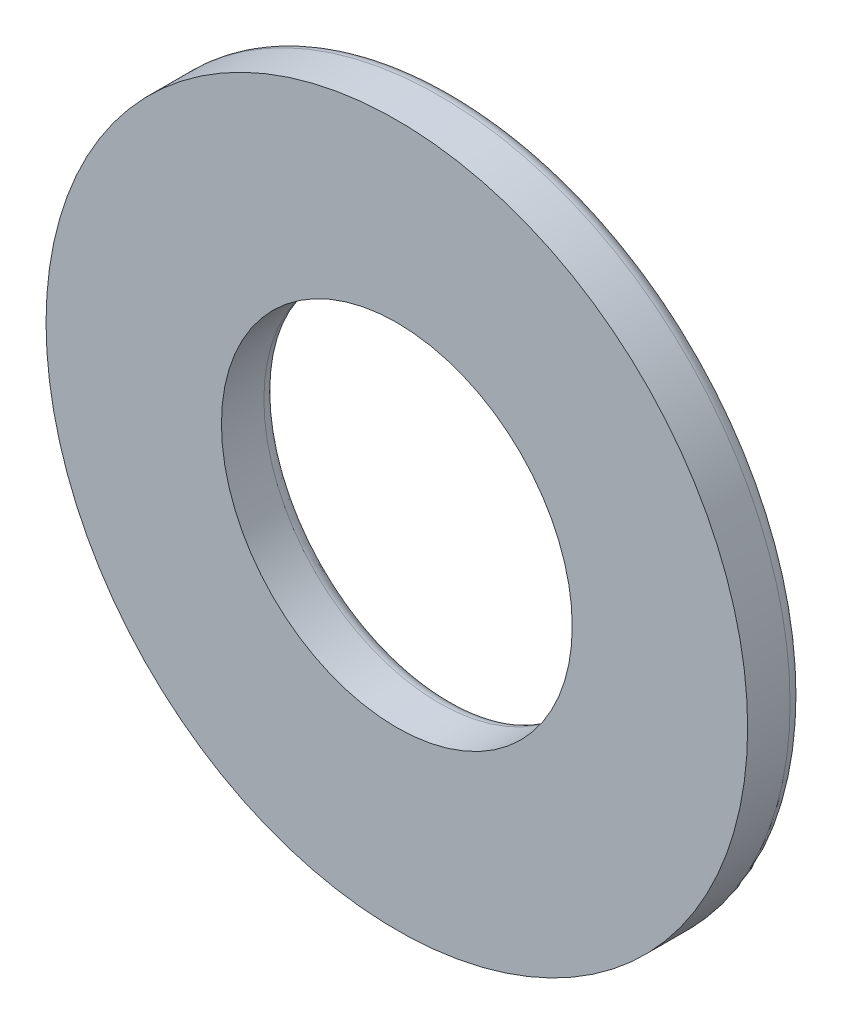
ISO-10303-21;
HEADER;
FILE_DESCRIPTION(('STEP AP214'),'2;1');
FILE_NAME('part.step','',(''),(''),'','','');
FILE_SCHEMA(('AUTOMOTIVE_DESIGN { 1 0 10303 214 1 1 1 1 }'));
ENDSEC;
DATA;
#1=APPLICATION_CONTEXT('core data for automotive mechanical design processes');
#2=APPLICATION_PROTOCOL_DEFINITION('international standard','automotive_design',2000,#1);
#3=PRODUCT_CONTEXT('',#1,'mechanical');
#4=PRODUCT('Part','Part','',(#3));
#5=PRODUCT_RELATED_PRODUCT_CATEGORY('part','',(#4));
#6=PRODUCT_DEFINITION_FORMATION('','',#4);
#7=PRODUCT_DEFINITION_CONTEXT('part definition',#1,'design');
#8=PRODUCT_DEFINITION('design','',#6,#7);
#9=PRODUCT_DEFINITION_SHAPE('','',#8);
#10=(LENGTH_UNIT() NAMED_UNIT(*) SI_UNIT(.MILLI.,.METRE.));
#11=(NAMED_UNIT(*) PLANE_ANGLE_UNIT() SI_UNIT($,.RADIAN.));
#12=(NAMED_UNIT(*) SI_UNIT($,.STERADIAN.) SOLID_ANGLE_UNIT());
#13=UNCERTAINTY_MEASURE_WITH_UNIT(LENGTH_MEASURE(1.E-05),#10,'distance_accuracy_value','');
#14=(GEOMETRIC_REPRESENTATION_CONTEXT(3) GLOBAL_UNCERTAINTY_ASSIGNED_CONTEXT((#13)) GLOBAL_UNIT_ASSIGNED_CONTEXT((#10,
#11,#12)) REPRESENTATION_CONTEXT('',''));
#15=CARTESIAN_POINT('',(0.,0.,0.));
#16=DIRECTION('',(0.,0.,1.));
#17=DIRECTION('',(1.,0.,0.));
#18=AXIS2_PLACEMENT_3D('',#15,#16,#17);
#19=CARTESIAN_POINT('',(0.,0.,0.831850000000007));
#20=DIRECTION('',(0.,0.,1.));
#21=DIRECTION('',(1.,0.,0.));
#22=AXIS2_PLACEMENT_3D('',#19,#20,#21);
#23=PLANE('',#22);
#24=CARTESIAN_POINT('',(0.,0.,0.831850000000007));
#25=DIRECTION('',(0.,0.,1.));
#26=DIRECTION('',(1.,0.,0.));
#27=AXIS2_PLACEMENT_3D('',#24,#25,#26);
#28=CIRCLE('',#27,10.3124);
#29=CARTESIAN_POINT('',(-10.3124,0.,0.831850000000007));
#30=VERTEX_POINT('',#29);
#31=EDGE_CURVE('E57',#30,#30,#28,.T.);
#32=ORIENTED_EDGE('',*,*,#31,.T.);
#33=EDGE_LOOP('',(#32));
#34=FACE_BOUND('',#33,.T.);
#35=CARTESIAN_POINT('',(0.,0.,0.831850000000007));
#36=DIRECTION('',(0.,0.,1.));
#37=DIRECTION('',(1.,0.,0.));
#38=AXIS2_PLACEMENT_3D('',#35,#36,#37);
#39=CIRCLE('',#38,5.1562);
#40=CARTESIAN_POINT('',(-5.1562,0.,0.831850000000007));
#41=VERTEX_POINT('',#40);
#42=EDGE_CURVE('E60',#41,#41,#39,.T.);
#43=ORIENTED_EDGE('',*,*,#42,.F.);
#44=EDGE_LOOP('',(#43));
#45=FACE_BOUND('',#44,.T.);
#46=ADVANCED_FACE('F37',(#34,#45),#23,.T.);
#47=CARTESIAN_POINT('',(0.,0.,0.831850000000007));
#48=DIRECTION('',(0.,0.,-1.));
#49=DIRECTION('',(-1.,0.,0.));
#50=AXIS2_PLACEMENT_3D('',#47,#48,#49);
#51=CYLINDRICAL_SURFACE('',#50,10.3124);
#52=CARTESIAN_POINT('',(0.,0.,-0.415925000000007));
#53=DIRECTION('',(0.,0.,1.));
#54=DIRECTION('',(1.,0.,0.));
#55=AXIS2_PLACEMENT_3D('',#52,#53,#54);
#56=CIRCLE('',#55,10.3124);
#57=CARTESIAN_POINT('',(-10.3124,0.,-0.415925000000007));
#58=VERTEX_POINT('',#57);
#59=EDGE_CURVE('E52',#58,#58,#56,.T.);
#60=CARTESIAN_POINT('',(-10.3124,0.,-0.415925000000007));
#61=CARTESIAN_POINT('',(-10.3124,0.,-0.402927343750007));
#62=CARTESIAN_POINT('',(-10.3124,0.,-0.389929687500007));
#63=CARTESIAN_POINT('',(-10.3124,0.,-0.363934375000006));
#64=CARTESIAN_POINT('',(-10.3124,0.,-0.350936718750006));
#65=CARTESIAN_POINT('',(-10.3124,0.,-0.324941406250006));
#66=CARTESIAN_POINT('',(-10.3124,0.,-0.311943750000006));
#67=CARTESIAN_POINT('',(-10.3124,0.,-0.285948437500005));
#68=CARTESIAN_POINT('',(-10.3124,0.,-0.272950781250005));
#69=CARTESIAN_POINT('',(-10.3124,0.,-0.246955468750005));
#70=CARTESIAN_POINT('',(-10.3124,0.,-0.233957812500005));
#71=CARTESIAN_POINT('',(-10.3124,0.,-0.207962500000005));
#72=CARTESIAN_POINT('',(-10.3124,0.,-0.194964843750005));
#73=CARTESIAN_POINT('',(-10.3124,0.,-0.168969531250004));
#74=CARTESIAN_POINT('',(-10.3124,0.,-0.155971875000004));
#75=CARTESIAN_POINT('',(-10.3124,0.,-0.129976562500004));
#76=CARTESIAN_POINT('',(-10.3124,0.,-0.116978906250004));
#77=CARTESIAN_POINT('',(-10.3124,0.,-0.0909835937500034));
#78=CARTESIAN_POINT('',(-10.3124,0.,-0.0779859375000032));
#79=CARTESIAN_POINT('',(-10.3124,0.,-0.051990625000003));
#80=CARTESIAN_POINT('',(-10.3124,0.,-0.0389929687500028));
#81=CARTESIAN_POINT('',(-10.3124,0.,-0.0129976562500025));
#82=CARTESIAN_POINT('',(-10.3124,0.,0.));
#83=CARTESIAN_POINT('',(-10.3124,0.,0.025995312499998));
#84=CARTESIAN_POINT('',(-10.3124,0.,0.0389929687499981));
#85=CARTESIAN_POINT('',(-10.3124,0.,0.0649882812499984));
#86=CARTESIAN_POINT('',(-10.3124,0.,0.0779859374999986));
#87=CARTESIAN_POINT('',(-10.3124,0.,0.103981249999999));
#88=CARTESIAN_POINT('',(-10.3124,0.,0.116978906249999));
#89=CARTESIAN_POINT('',(-10.3124,0.,0.142974218749999));
#90=CARTESIAN_POINT('',(-10.3124,0.,0.155971874999999));
#91=CARTESIAN_POINT('',(-10.3124,0.,0.1819671875));
#92=CARTESIAN_POINT('',(-10.3124,0.,0.19496484375));
#93=CARTESIAN_POINT('',(-10.3124,0.,0.22096015625));
#94=CARTESIAN_POINT('',(-10.3124,0.,0.2339578125));
#95=CARTESIAN_POINT('',(-10.3124,0.,0.259953125000001));
#96=CARTESIAN_POINT('',(-10.3124,0.,0.272950781250001));
#97=CARTESIAN_POINT('',(-10.3124,0.,0.298946093750001));
#98=CARTESIAN_POINT('',(-10.3124,0.,0.311943750000001));
#99=CARTESIAN_POINT('',(-10.3124,0.,0.337939062500001));
#100=CARTESIAN_POINT('',(-10.3124,0.,0.350936718750001));
#101=CARTESIAN_POINT('',(-10.3124,0.,0.376932031250002));
#102=CARTESIAN_POINT('',(-10.3124,0.,0.389929687500002));
#103=CARTESIAN_POINT('',(-10.3124,0.,0.415925000000002));
#104=CARTESIAN_POINT('',(-10.3124,0.,0.428922656250002));
#105=CARTESIAN_POINT('',(-10.3124,0.,0.454917968750003));
#106=CARTESIAN_POINT('',(-10.3124,0.,0.467915625000003));
#107=CARTESIAN_POINT('',(-10.3124,0.,0.493910937500003));
#108=CARTESIAN_POINT('',(-10.3124,0.,0.506908593750003));
#109=CARTESIAN_POINT('',(-10.3124,0.,0.532903906250004));
#110=CARTESIAN_POINT('',(-10.3124,0.,0.545901562500004));
#111=CARTESIAN_POINT('',(-10.3124,0.,0.571896875000004));
#112=CARTESIAN_POINT('',(-10.3124,0.,0.584894531250004));
#113=CARTESIAN_POINT('',(-10.3124,0.,0.610889843750004));
#114=CARTESIAN_POINT('',(-10.3124,0.,0.623887500000005));
#115=CARTESIAN_POINT('',(-10.3124,0.,0.649882812500005));
#116=CARTESIAN_POINT('',(-10.3124,0.,0.662880468750005));
#117=CARTESIAN_POINT('',(-10.3124,0.,0.688875781250005));
#118=CARTESIAN_POINT('',(-10.3124,0.,0.701873437500005));
#119=CARTESIAN_POINT('',(-10.3124,0.,0.727868750000006));
#120=CARTESIAN_POINT('',(-10.3124,0.,0.740866406250006));
#121=CARTESIAN_POINT('',(-10.3124,0.,0.766861718750006));
#122=CARTESIAN_POINT('',(-10.3124,0.,0.779859375000006));
#123=CARTESIAN_POINT('',(-10.3124,0.,0.805854687500007));
#124=CARTESIAN_POINT('',(-10.3124,0.,0.818852343750007));
#125=CARTESIAN_POINT('',(-10.3124,0.,0.831850000000007));
#126=B_SPLINE_CURVE_WITH_KNOTS('',3,(#60,#61,#62,#63,#64,#65,#66,#67,#68,#69,#70,#71,#72,#73,
#74,#75,#76,#77,#78,#79,#80,#81,#82,#83,#84,#85,#86,#87,#88,#89,#90,#91,#92,#93,#94,#95,#96,#97,
#98,#99,#100,#101,#102,#103,#104,#105,#106,#107,#108,#109,#110,#111,#112,#113,#114,#115,#116,
#117,#118,#119,#120,#121,#122,#123,#124,#125),.UNSPECIFIED.,.F.,.F.,(4,2,2,2,2,2,2,2,2,2,2,2,2,
2,2,2,2,2,2,2,2,2,2,2,2,2,2,2,2,2,2,2,4),(0.,0.0389929687500004,0.0779859375000008,
0.116978906250001,0.155971875000002,0.194964843750002,0.233957812500003,0.272950781250003,
0.311943750000003,0.350936718750004,0.389929687500004,0.428922656250005,0.467915625000005,
0.506908593750006,0.545901562500006,0.584894531250006,0.623887500000007,0.662880468750007,
0.701873437500008,0.740866406250008,0.779859375000008,0.818852343750009,0.857845312500009,
0.89683828125001,0.93583125000001,0.974824218750011,1.01381718750001,1.05281015625001,
1.09180312500001,1.13079609375001,1.16978906250001,1.20878203125001,1.24777500000001),.UNSPECIFIED.);
#127=EDGE_CURVE('BSEAM67',#58,#30,#126,.T.);
#128=ORIENTED_EDGE('',*,*,#59,.T.);
#129=ORIENTED_EDGE('',*,*,#31,.F.);
#130=ORIENTED_EDGE('',*,*,#127,.T.);
#131=ORIENTED_EDGE('',*,*,#127,.F.);
#132=EDGE_LOOP('',(#128,#130,#129,#131));
#133=FACE_BOUND('',#132,.T.);
#134=ADVANCED_FACE('F67',(#133),#51,.T.);
#135=CARTESIAN_POINT('',(0.,0.,0.831850000000007));
#136=DIRECTION('',(0.,0.,-1.));
#137=DIRECTION('',(-1.,0.,0.));
#138=AXIS2_PLACEMENT_3D('',#135,#136,#137);
#139=CYLINDRICAL_SURFACE('',#138,5.1562);
#140=CARTESIAN_POINT('',(0.,0.,-0.415925000000007));
#141=DIRECTION('',(0.,0.,1.));
#142=DIRECTION('',(1.,0.,0.));
#143=AXIS2_PLACEMENT_3D('',#140,#141,#142);
#144=CIRCLE('',#143,5.1562);
#145=CARTESIAN_POINT('',(-5.1562,0.,-0.415925000000007));
#146=VERTEX_POINT('',#145);
#147=EDGE_CURVE('E10',#146,#146,#144,.F.);
#148=CARTESIAN_POINT('',(-5.1562,0.,-0.415925000000007));
#149=CARTESIAN_POINT('',(-5.1562,0.,-0.402927343750007));
#150=CARTESIAN_POINT('',(-5.1562,0.,-0.389929687500007));
#151=CARTESIAN_POINT('',(-5.1562,0.,-0.363934375000006));
#152=CARTESIAN_POINT('',(-5.1562,0.,-0.350936718750006));
#153=CARTESIAN_POINT('',(-5.1562,0.,-0.324941406250006));
#154=CARTESIAN_POINT('',(-5.1562,0.,-0.311943750000006));
#155=CARTESIAN_POINT('',(-5.1562,0.,-0.285948437500005));
#156=CARTESIAN_POINT('',(-5.1562,0.,-0.272950781250005));
#157=CARTESIAN_POINT('',(-5.1562,0.,-0.246955468750005));
#158=CARTESIAN_POINT('',(-5.1562,0.,-0.233957812500005));
#159=CARTESIAN_POINT('',(-5.1562,0.,-0.207962500000005));
#160=CARTESIAN_POINT('',(-5.1562,0.,-0.194964843750005));
#161=CARTESIAN_POINT('',(-5.1562,0.,-0.168969531250004));
#162=CARTESIAN_POINT('',(-5.1562,0.,-0.155971875000004));
#163=CARTESIAN_POINT('',(-5.1562,0.,-0.129976562500004));
#164=CARTESIAN_POINT('',(-5.1562,0.,-0.116978906250004));
#165=CARTESIAN_POINT('',(-5.1562,0.,-0.0909835937500034));
#166=CARTESIAN_POINT('',(-5.1562,0.,-0.0779859375000032));
#167=CARTESIAN_POINT('',(-5.1562,0.,-0.051990625000003));
#168=CARTESIAN_POINT('',(-5.1562,0.,-0.0389929687500028));
#169=CARTESIAN_POINT('',(-5.1562,0.,-0.0129976562500025));
#170=CARTESIAN_POINT('',(-5.1562,0.,0.));
#171=CARTESIAN_POINT('',(-5.1562,0.,0.025995312499998));
#172=CARTESIAN_POINT('',(-5.1562,0.,0.0389929687499981));
#173=CARTESIAN_POINT('',(-5.1562,0.,0.0649882812499984));
#174=CARTESIAN_POINT('',(-5.1562,0.,0.0779859374999986));
#175=CARTESIAN_POINT('',(-5.1562,0.,0.103981249999999));
#176=CARTESIAN_POINT('',(-5.1562,0.,0.116978906249999));
#177=CARTESIAN_POINT('',(-5.1562,0.,0.142974218749999));
#178=CARTESIAN_POINT('',(-5.1562,0.,0.155971874999999));
#179=CARTESIAN_POINT('',(-5.1562,0.,0.1819671875));
#180=CARTESIAN_POINT('',(-5.1562,0.,0.19496484375));
#181=CARTESIAN_POINT('',(-5.1562,0.,0.22096015625));
#182=CARTESIAN_POINT('',(-5.1562,0.,0.2339578125));
#183=CARTESIAN_POINT('',(-5.1562,0.,0.259953125000001));
#184=CARTESIAN_POINT('',(-5.1562,0.,0.272950781250001));
#185=CARTESIAN_POINT('',(-5.1562,0.,0.298946093750001));
#186=CARTESIAN_POINT('',(-5.1562,0.,0.311943750000001));
#187=CARTESIAN_POINT('',(-5.1562,0.,0.337939062500001));
#188=CARTESIAN_POINT('',(-5.1562,0.,0.350936718750001));
#189=CARTESIAN_POINT('',(-5.1562,0.,0.376932031250002));
#190=CARTESIAN_POINT('',(-5.1562,0.,0.389929687500002));
#191=CARTESIAN_POINT('',(-5.1562,0.,0.415925000000002));
#192=CARTESIAN_POINT('',(-5.1562,0.,0.428922656250002));
#193=CARTESIAN_POINT('',(-5.1562,0.,0.454917968750003));
#194=CARTESIAN_POINT('',(-5.1562,0.,0.467915625000003));
#195=CARTESIAN_POINT('',(-5.1562,0.,0.493910937500003));
#196=CARTESIAN_POINT('',(-5.1562,0.,0.506908593750003));
#197=CARTESIAN_POINT('',(-5.1562,0.,0.532903906250004));
#198=CARTESIAN_POINT('',(-5.1562,0.,0.545901562500004));
#199=CARTESIAN_POINT('',(-5.1562,0.,0.571896875000004));
#200=CARTESIAN_POINT('',(-5.1562,0.,0.584894531250004));
#201=CARTESIAN_POINT('',(-5.1562,0.,0.610889843750004));
#202=CARTESIAN_POINT('',(-5.1562,0.,0.623887500000005));
#203=CARTESIAN_POINT('',(-5.1562,0.,0.649882812500005));
#204=CARTESIAN_POINT('',(-5.1562,0.,0.662880468750005));
#205=CARTESIAN_POINT('',(-5.1562,0.,0.688875781250005));
#206=CARTESIAN_POINT('',(-5.1562,0.,0.701873437500005));
#207=CARTESIAN_POINT('',(-5.1562,0.,0.727868750000006));
#208=CARTESIAN_POINT('',(-5.1562,0.,0.740866406250006));
#209=CARTESIAN_POINT('',(-5.1562,0.,0.766861718750006));
#210=CARTESIAN_POINT('',(-5.1562,0.,0.779859375000006));
#211=CARTESIAN_POINT('',(-5.1562,0.,0.805854687500007));
#212=CARTESIAN_POINT('',(-5.1562,0.,0.818852343750007));
#213=CARTESIAN_POINT('',(-5.1562,0.,0.831850000000007));
#214=B_SPLINE_CURVE_WITH_KNOTS('',3,(#148,#149,#150,#151,#152,#153,#154,#155,#156,#157,#158,
#159,#160,#161,#162,#163,#164,#165,#166,#167,#168,#169,#170,#171,#172,#173,#174,#175,#176,#177,
#178,#179,#180,#181,#182,#183,#184,#185,#186,#187,#188,#189,#190,#191,#192,#193,#194,#195,#196,
#197,#198,#199,#200,#201,#202,#203,#204,#205,#206,#207,#208,#209,#210,#211,#212,#213),
.UNSPECIFIED.,.F.,.F.,(4,2,2,2,2,2,2,2,2,2,2,2,2,2,2,2,2,2,2,2,2,2,2,2,2,2,2,2,2,2,2,2,4),(0.,
0.0389929687500004,0.0779859375000008,0.116978906250001,0.155971875000002,0.194964843750002,
0.233957812500003,0.272950781250003,0.311943750000003,0.350936718750004,0.389929687500004,
0.428922656250005,0.467915625000005,0.506908593750006,0.545901562500006,0.584894531250006,
0.623887500000007,0.662880468750007,0.701873437500008,0.740866406250008,0.779859375000008,
0.818852343750009,0.857845312500009,0.89683828125001,0.93583125000001,0.974824218750011,
1.01381718750001,1.05281015625001,1.09180312500001,1.13079609375001,1.16978906250001,
1.20878203125001,1.24777500000001),.UNSPECIFIED.);
#215=EDGE_CURVE('BSEAM64',#146,#41,#214,.T.);
#216=ORIENTED_EDGE('',*,*,#147,.T.);
#217=ORIENTED_EDGE('',*,*,#42,.T.);
#218=ORIENTED_EDGE('',*,*,#215,.T.);
#219=ORIENTED_EDGE('',*,*,#215,.F.);
#220=EDGE_LOOP('',(#216,#218,#217,#219));
#221=FACE_BOUND('',#220,.T.);
#222=ADVANCED_FACE('F64',(#221),#139,.F.);
#223=CARTESIAN_POINT('',(0.,0.,-0.831850000000007));
#224=DIRECTION('',(0.,0.,1.));
#225=DIRECTION('',(1.,0.,0.));
#226=AXIS2_PLACEMENT_3D('',#223,#224,#225);
#227=PLANE('',#226);
#228=CARTESIAN_POINT('',(0.,0.,-0.831850000000007));
#229=DIRECTION('',(0.,0.,1.));
#230=DIRECTION('',(1.,0.,0.));
#231=AXIS2_PLACEMENT_3D('',#228,#229,#230);
#232=CIRCLE('',#231,9.896475);
#233=CARTESIAN_POINT('',(9.896475,0.,-0.831850000000007));
#234=VERTEX_POINT('',#233);
#235=EDGE_CURVE('E44',#234,#234,#232,.F.);
#236=ORIENTED_EDGE('',*,*,#235,.T.);
#237=EDGE_LOOP('',(#236));
#238=FACE_BOUND('',#237,.T.);
#239=CARTESIAN_POINT('',(0.,0.,-0.831850000000007));
#240=DIRECTION('',(0.,0.,1.));
#241=DIRECTION('',(1.,0.,0.));
#242=AXIS2_PLACEMENT_3D('',#239,#240,#241);
#243=CIRCLE('',#242,5.572125);
#244=CARTESIAN_POINT('',(5.572125,0.,-0.831850000000007));
#245=VERTEX_POINT('',#244);
#246=EDGE_CURVE('E48',#245,#245,#243,.T.);
#247=ORIENTED_EDGE('',*,*,#246,.T.);
#248=EDGE_LOOP('',(#247));
#249=FACE_BOUND('',#248,.T.);
#250=ADVANCED_FACE('F79',(#238,#249),#227,.F.);
#251=CARTESIAN_POINT('',(0.,0.,-0.415925000000007));
#252=DIRECTION('',(0.,0.,1.));
#253=DIRECTION('',(1.,0.,0.));
#254=AXIS2_PLACEMENT_3D('',#251,#252,#253);
#255=TOROIDAL_SURFACE('',#254,9.896475,0.415925);
#256=ORIENTED_EDGE('',*,*,#235,.F.);
#257=EDGE_LOOP('',(#256));
#258=FACE_BOUND('',#257,.T.);
#259=ORIENTED_EDGE('',*,*,#59,.F.);
#260=EDGE_LOOP('',(#259));
#261=FACE_BOUND('',#260,.T.);
#262=ADVANCED_FACE('F77',(#258,#261),#255,.T.);
#263=CARTESIAN_POINT('',(0.,0.,-0.415925000000007));
#264=DIRECTION('',(0.,0.,1.));
#265=DIRECTION('',(1.,0.,0.));
#266=AXIS2_PLACEMENT_3D('',#263,#264,#265);
#267=TOROIDAL_SURFACE('',#266,5.572125,0.415925);
#268=ORIENTED_EDGE('',*,*,#147,.F.);
#269=EDGE_LOOP('',(#268));
#270=FACE_BOUND('',#269,.T.);
#271=ORIENTED_EDGE('',*,*,#246,.F.);
#272=EDGE_LOOP('',(#271));
#273=FACE_BOUND('',#272,.T.);
#274=ADVANCED_FACE('F39',(#270,#273),#267,.T.);
#275=CLOSED_SHELL('',(#46,#134,#222,#250,#262,#274));
#276=MANIFOLD_SOLID_BREP('B2',#275);
#277=ADVANCED_BREP_SHAPE_REPRESENTATION('',(#18,#276),#14);
#278=SHAPE_DEFINITION_REPRESENTATION(#9,#277);
ENDSEC;
END-ISO-10303-21;
